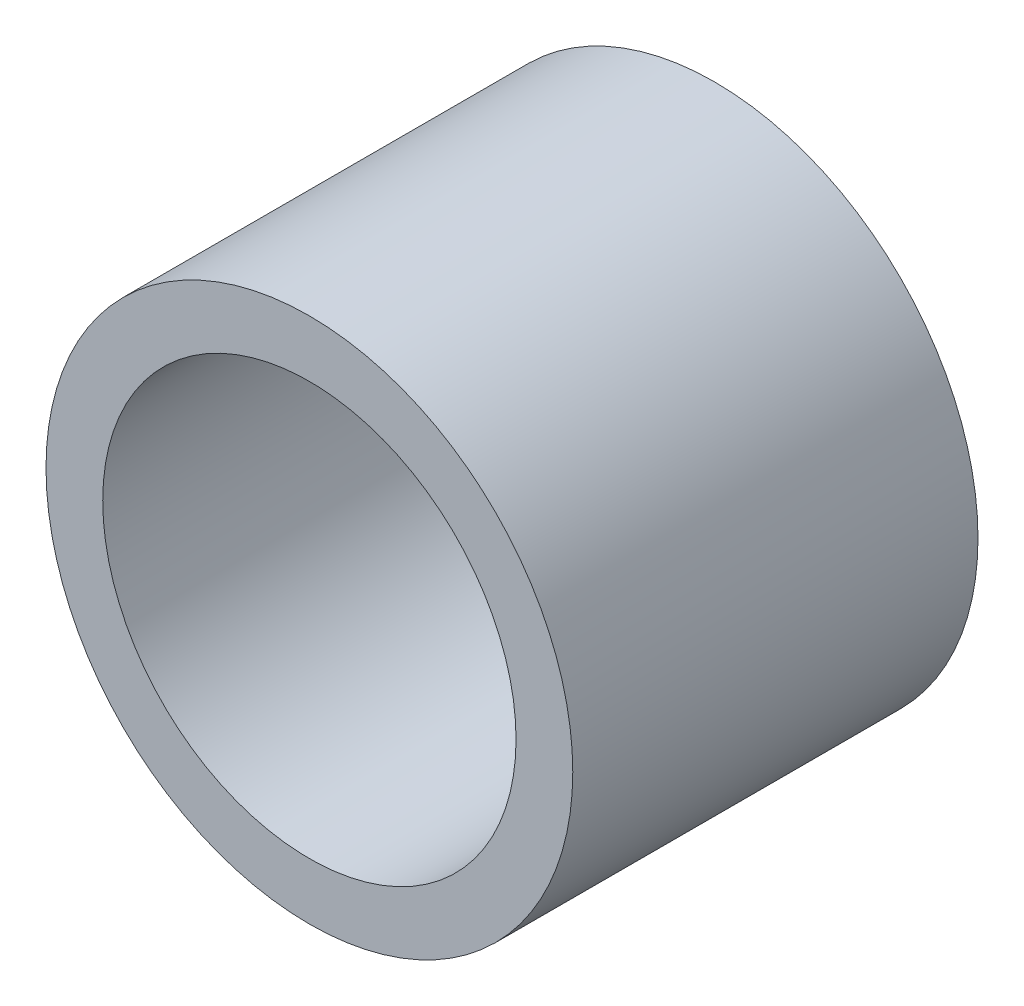
ISO-10303-21;
HEADER;
FILE_DESCRIPTION(('STEP AP214'),'2;1');
FILE_NAME('part.step','',(''),(''),'','','');
FILE_SCHEMA(('AUTOMOTIVE_DESIGN { 1 0 10303 214 1 1 1 1 }'));
ENDSEC;
DATA;
#1=APPLICATION_CONTEXT('core data for automotive mechanical design processes');
#2=APPLICATION_PROTOCOL_DEFINITION('international standard','automotive_design',2000,#1);
#3=PRODUCT_CONTEXT('',#1,'mechanical');
#4=PRODUCT('Part','Part','',(#3));
#5=PRODUCT_RELATED_PRODUCT_CATEGORY('part','',(#4));
#6=PRODUCT_DEFINITION_FORMATION('','',#4);
#7=PRODUCT_DEFINITION_CONTEXT('part definition',#1,'design');
#8=PRODUCT_DEFINITION('design','',#6,#7);
#9=PRODUCT_DEFINITION_SHAPE('','',#8);
#10=(LENGTH_UNIT() NAMED_UNIT(*) SI_UNIT(.MILLI.,.METRE.));
#11=(NAMED_UNIT(*) PLANE_ANGLE_UNIT() SI_UNIT($,.RADIAN.));
#12=(NAMED_UNIT(*) SI_UNIT($,.STERADIAN.) SOLID_ANGLE_UNIT());
#13=UNCERTAINTY_MEASURE_WITH_UNIT(LENGTH_MEASURE(1.E-05),#10,'distance_accuracy_value','');
#14=(GEOMETRIC_REPRESENTATION_CONTEXT(3) GLOBAL_UNCERTAINTY_ASSIGNED_CONTEXT((#13)) GLOBAL_UNIT_ASSIGNED_CONTEXT((#10,
#11,#12)) REPRESENTATION_CONTEXT('',''));
#15=CARTESIAN_POINT('',(0.,0.,0.));
#16=DIRECTION('',(0.,0.,1.));
#17=DIRECTION('',(1.,0.,0.));
#18=AXIS2_PLACEMENT_3D('',#15,#16,#17);
#19=CARTESIAN_POINT('',(0.,0.,5.));
#20=DIRECTION('',(0.,0.,1.));
#21=DIRECTION('',(1.,0.,0.));
#22=AXIS2_PLACEMENT_3D('',#19,#20,#21);
#23=PLANE('',#22);
#24=CARTESIAN_POINT('',(0.,0.,5.));
#25=DIRECTION('',(0.,0.,1.));
#26=DIRECTION('',(1.,0.,0.));
#27=AXIS2_PLACEMENT_3D('',#24,#25,#26);
#28=CIRCLE('',#27,3.25);
#29=CARTESIAN_POINT('',(3.25,0.,5.));
#30=VERTEX_POINT('',#29);
#31=EDGE_CURVE('E10',#30,#30,#28,.T.);
#32=ORIENTED_EDGE('',*,*,#31,.T.);
#33=EDGE_LOOP('',(#32));
#34=FACE_BOUND('',#33,.T.);
#35=CARTESIAN_POINT('',(0.,0.,5.));
#36=DIRECTION('',(0.,0.,1.));
#37=DIRECTION('',(1.,0.,0.));
#38=AXIS2_PLACEMENT_3D('',#35,#36,#37);
#39=CIRCLE('',#38,2.55);
#40=CARTESIAN_POINT('',(2.55,0.,5.));
#41=VERTEX_POINT('',#40);
#42=EDGE_CURVE('E44',#41,#41,#39,.T.);
#43=ORIENTED_EDGE('',*,*,#42,.F.);
#44=EDGE_LOOP('',(#43));
#45=FACE_BOUND('',#44,.T.);
#46=ADVANCED_FACE('F33',(#34,#45),#23,.T.);
#47=CARTESIAN_POINT('',(0.,0.,0.));
#48=DIRECTION('',(0.,0.,1.));
#49=DIRECTION('',(1.,0.,0.));
#50=AXIS2_PLACEMENT_3D('',#47,#48,#49);
#51=PLANE('',#50);
#52=CARTESIAN_POINT('',(0.,0.,0.));
#53=DIRECTION('',(0.,0.,1.));
#54=DIRECTION('',(1.,0.,0.));
#55=AXIS2_PLACEMENT_3D('',#52,#53,#54);
#56=CIRCLE('',#55,3.25);
#57=CARTESIAN_POINT('',(3.25,0.,0.));
#58=VERTEX_POINT('',#57);
#59=EDGE_CURVE('E37',#58,#58,#56,.T.);
#60=ORIENTED_EDGE('',*,*,#59,.F.);
#61=EDGE_LOOP('',(#60));
#62=FACE_BOUND('',#61,.T.);
#63=CARTESIAN_POINT('',(0.,0.,0.));
#64=DIRECTION('',(0.,0.,1.));
#65=DIRECTION('',(1.,0.,0.));
#66=AXIS2_PLACEMENT_3D('',#63,#64,#65);
#67=CIRCLE('',#66,2.55);
#68=CARTESIAN_POINT('',(2.55,0.,0.));
#69=VERTEX_POINT('',#68);
#70=EDGE_CURVE('E46',#69,#69,#67,.T.);
#71=ORIENTED_EDGE('',*,*,#70,.T.);
#72=EDGE_LOOP('',(#71));
#73=FACE_BOUND('',#72,.T.);
#74=ADVANCED_FACE('F56',(#62,#73),#51,.F.);
#75=CARTESIAN_POINT('',(0.,0.,5.));
#76=DIRECTION('',(0.,0.,-1.));
#77=DIRECTION('',(-1.,0.,0.));
#78=AXIS2_PLACEMENT_3D('',#75,#76,#77);
#79=CYLINDRICAL_SURFACE('',#78,3.25);
#80=ORIENTED_EDGE('',*,*,#31,.F.);
#81=EDGE_LOOP('',(#80));
#82=FACE_BOUND('',#81,.T.);
#83=ORIENTED_EDGE('',*,*,#59,.T.);
#84=EDGE_LOOP('',(#83));
#85=FACE_BOUND('',#84,.T.);
#86=ADVANCED_FACE('F35',(#82,#85),#79,.T.);
#87=CARTESIAN_POINT('',(0.,0.,5.));
#88=DIRECTION('',(0.,0.,-1.));
#89=DIRECTION('',(-1.,0.,0.));
#90=AXIS2_PLACEMENT_3D('',#87,#88,#89);
#91=CYLINDRICAL_SURFACE('',#90,2.55);
#92=ORIENTED_EDGE('',*,*,#42,.T.);
#93=EDGE_LOOP('',(#92));
#94=FACE_BOUND('',#93,.T.);
#95=ORIENTED_EDGE('',*,*,#70,.F.);
#96=EDGE_LOOP('',(#95));
#97=FACE_BOUND('',#96,.T.);
#98=ADVANCED_FACE('F52',(#94,#97),#91,.F.);
#99=CLOSED_SHELL('',(#46,#74,#86,#98));
#100=MANIFOLD_SOLID_BREP('B2',#99);
#101=ADVANCED_BREP_SHAPE_REPRESENTATION('',(#18,#100),#14);
#102=SHAPE_DEFINITION_REPRESENTATION(#9,#101);
ENDSEC;
END-ISO-10303-21;
